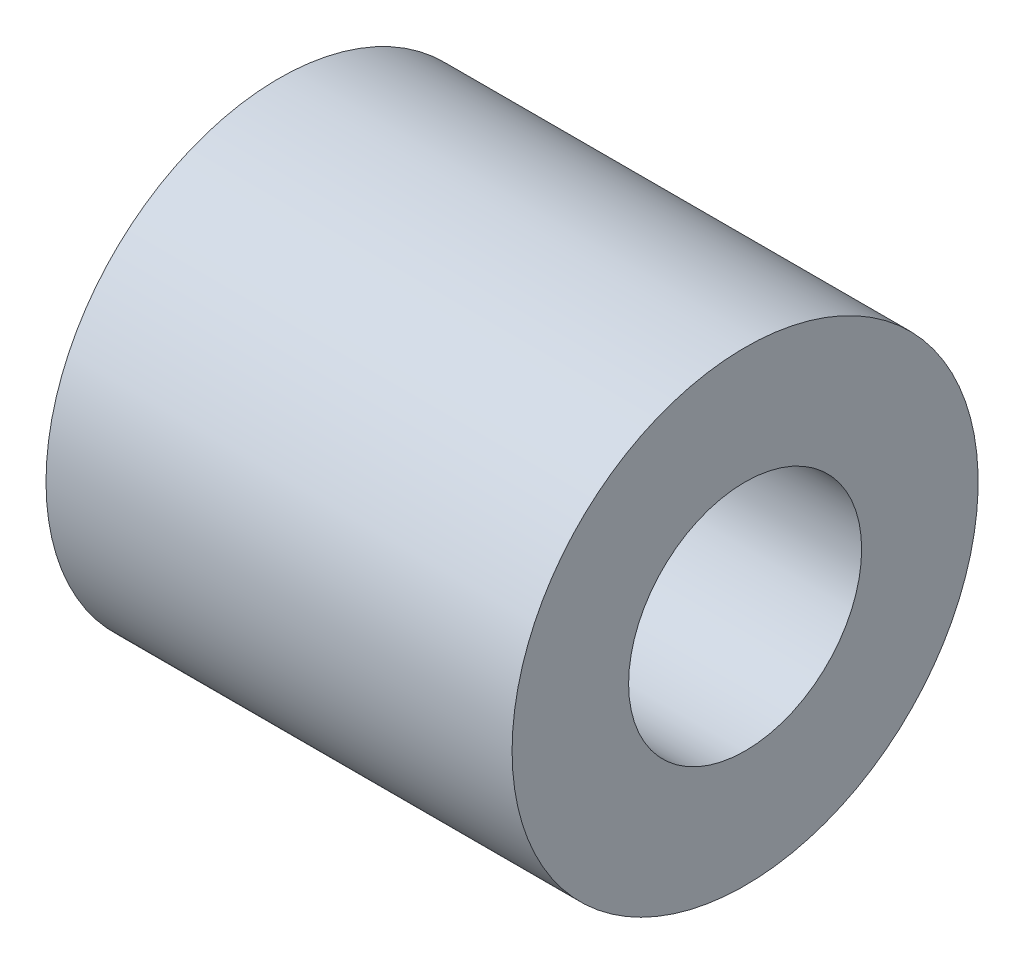
ISO-10303-21;
HEADER;
FILE_DESCRIPTION(('STEP AP214'),'2;1');
FILE_NAME('part.step','',(''),(''),'','','');
FILE_SCHEMA(('AUTOMOTIVE_DESIGN { 1 0 10303 214 1 1 1 1 }'));
ENDSEC;
DATA;
#1=APPLICATION_CONTEXT('core data for automotive mechanical design processes');
#2=APPLICATION_PROTOCOL_DEFINITION('international standard','automotive_design',2000,#1);
#3=PRODUCT_CONTEXT('',#1,'mechanical');
#4=PRODUCT('Part','Part','',(#3));
#5=PRODUCT_RELATED_PRODUCT_CATEGORY('part','',(#4));
#6=PRODUCT_DEFINITION_FORMATION('','',#4);
#7=PRODUCT_DEFINITION_CONTEXT('part definition',#1,'design');
#8=PRODUCT_DEFINITION('design','',#6,#7);
#9=PRODUCT_DEFINITION_SHAPE('','',#8);
#10=(LENGTH_UNIT() NAMED_UNIT(*) SI_UNIT(.MILLI.,.METRE.));
#11=(NAMED_UNIT(*) PLANE_ANGLE_UNIT() SI_UNIT($,.RADIAN.));
#12=(NAMED_UNIT(*) SI_UNIT($,.STERADIAN.) SOLID_ANGLE_UNIT());
#13=UNCERTAINTY_MEASURE_WITH_UNIT(LENGTH_MEASURE(1.E-05),#10,'distance_accuracy_value','');
#14=(GEOMETRIC_REPRESENTATION_CONTEXT(3) GLOBAL_UNCERTAINTY_ASSIGNED_CONTEXT((#13)) GLOBAL_UNIT_ASSIGNED_CONTEXT((#10,
#11,#12)) REPRESENTATION_CONTEXT('',''));
#15=CARTESIAN_POINT('',(0.,0.,0.));
#16=DIRECTION('',(0.,0.,1.));
#17=DIRECTION('',(1.,0.,0.));
#18=AXIS2_PLACEMENT_3D('',#15,#16,#17);
#19=CARTESIAN_POINT('',(0.,0.,0.));
#20=DIRECTION('',(1.,0.,0.));
#21=DIRECTION('',(0.,0.,-1.));
#22=AXIS2_PLACEMENT_3D('',#19,#20,#21);
#23=PLANE('',#22);
#24=CARTESIAN_POINT('',(0.,0.,0.));
#25=DIRECTION('',(-1.,0.,0.));
#26=DIRECTION('',(0.,0.,1.));
#27=AXIS2_PLACEMENT_3D('',#24,#25,#26);
#28=CIRCLE('',#27,2.5);
#29=CARTESIAN_POINT('',(0.,0.,2.5));
#30=VERTEX_POINT('',#29);
#31=EDGE_CURVE('E10',#30,#30,#28,.T.);
#32=ORIENTED_EDGE('',*,*,#31,.T.);
#33=EDGE_LOOP('',(#32));
#34=FACE_BOUND('',#33,.T.);
#35=ADVANCED_FACE('F31',(#34),#23,.F.);
#36=CARTESIAN_POINT('',(0.,0.,0.));
#37=DIRECTION('',(-1.,0.,0.));
#38=DIRECTION('',(0.,0.,1.));
#39=AXIS2_PLACEMENT_3D('',#36,#37,#38);
#40=CYLINDRICAL_SURFACE('',#39,2.5);
#41=ORIENTED_EDGE('',*,*,#31,.F.);
#42=EDGE_LOOP('',(#41));
#43=FACE_BOUND('',#42,.T.);
#44=CARTESIAN_POINT('',(5.,0.,0.));
#45=DIRECTION('',(-1.,0.,0.));
#46=DIRECTION('',(0.,0.,1.));
#47=AXIS2_PLACEMENT_3D('',#44,#45,#46);
#48=CIRCLE('',#47,2.5);
#49=CARTESIAN_POINT('',(5.,0.,2.5));
#50=VERTEX_POINT('',#49);
#51=EDGE_CURVE('E37',#50,#50,#48,.T.);
#52=ORIENTED_EDGE('',*,*,#51,.T.);
#53=EDGE_LOOP('',(#52));
#54=FACE_BOUND('',#53,.T.);
#55=ADVANCED_FACE('F63',(#43,#54),#40,.T.);
#56=CARTESIAN_POINT('',(5.,0.,-2.5));
#57=DIRECTION('',(-1.,0.,0.));
#58=DIRECTION('',(0.,0.,1.));
#59=AXIS2_PLACEMENT_3D('',#56,#57,#58);
#60=PLANE('',#59);
#61=ORIENTED_EDGE('',*,*,#51,.F.);
#62=EDGE_LOOP('',(#61));
#63=FACE_BOUND('',#62,.T.);
#64=CARTESIAN_POINT('',(5.,0.,0.));
#65=DIRECTION('',(-1.,0.,0.));
#66=DIRECTION('',(0.,0.,1.));
#67=AXIS2_PLACEMENT_3D('',#64,#65,#66);
#68=CIRCLE('',#67,1.25);
#69=CARTESIAN_POINT('',(5.,0.,1.25));
#70=VERTEX_POINT('',#69);
#71=EDGE_CURVE('E41',#70,#70,#68,.T.);
#72=ORIENTED_EDGE('',*,*,#71,.T.);
#73=EDGE_LOOP('',(#72));
#74=FACE_BOUND('',#73,.T.);
#75=ADVANCED_FACE('F59',(#63,#74),#60,.F.);
#76=CARTESIAN_POINT('',(0.,0.,0.));
#77=DIRECTION('',(-1.,0.,0.));
#78=DIRECTION('',(0.,0.,1.));
#79=AXIS2_PLACEMENT_3D('',#76,#77,#78);
#80=CYLINDRICAL_SURFACE('',#79,1.25);
#81=ORIENTED_EDGE('',*,*,#71,.F.);
#82=EDGE_LOOP('',(#81));
#83=FACE_BOUND('',#82,.T.);
#84=CARTESIAN_POINT('',(2.,0.,0.));
#85=DIRECTION('',(-1.,0.,0.));
#86=DIRECTION('',(0.,0.,1.));
#87=AXIS2_PLACEMENT_3D('',#84,#85,#86);
#88=CIRCLE('',#87,1.25);
#89=CARTESIAN_POINT('',(2.,0.,1.25));
#90=VERTEX_POINT('',#89);
#91=EDGE_CURVE('E45',#90,#90,#88,.T.);
#92=ORIENTED_EDGE('',*,*,#91,.T.);
#93=EDGE_LOOP('',(#92));
#94=FACE_BOUND('',#93,.T.);
#95=ADVANCED_FACE('F51',(#83,#94),#80,.F.);
#96=CARTESIAN_POINT('',(2.,0.,-1.25));
#97=DIRECTION('',(-1.,0.,0.));
#98=DIRECTION('',(0.,0.,1.));
#99=AXIS2_PLACEMENT_3D('',#96,#97,#98);
#100=PLANE('',#99);
#101=ORIENTED_EDGE('',*,*,#91,.F.);
#102=EDGE_LOOP('',(#101));
#103=FACE_BOUND('',#102,.T.);
#104=ADVANCED_FACE('F53',(#103),#100,.F.);
#105=CLOSED_SHELL('',(#35,#55,#75,#95,#104));
#106=MANIFOLD_SOLID_BREP('B2',#105);
#107=ADVANCED_BREP_SHAPE_REPRESENTATION('',(#18,#106),#14);
#108=SHAPE_DEFINITION_REPRESENTATION(#9,#107);
ENDSEC;
END-ISO-10303-21;
